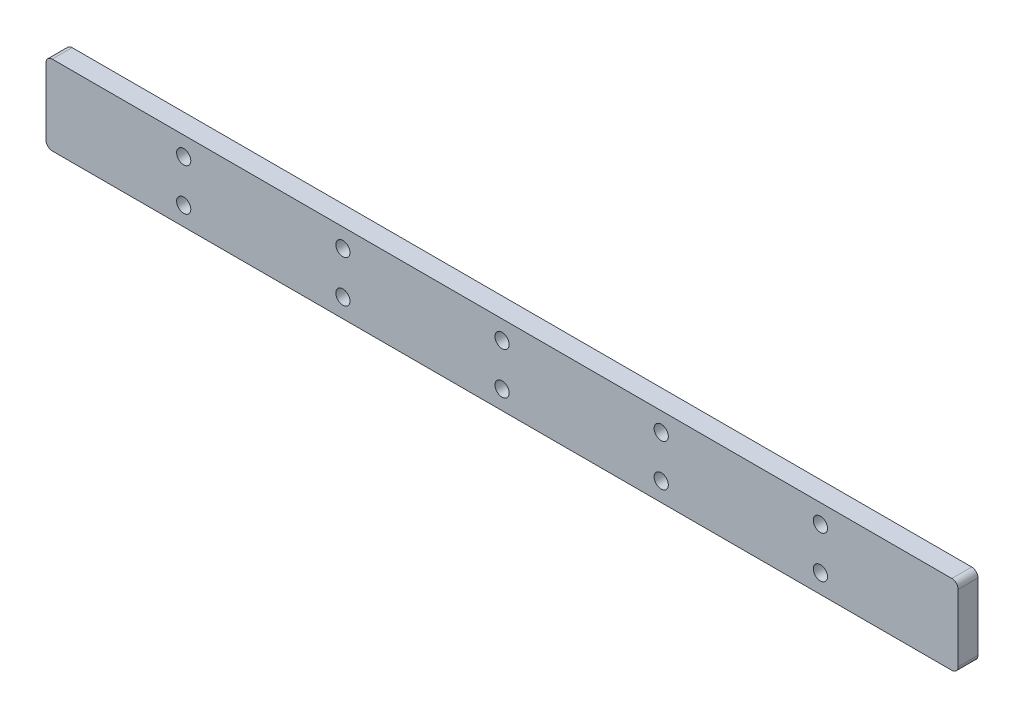
ISO-10303-21;
HEADER;
FILE_DESCRIPTION(('STEP AP214'),'2;1');
FILE_NAME('part.step','',(''),(''),'','','');
FILE_SCHEMA(('AUTOMOTIVE_DESIGN { 1 0 10303 214 1 1 1 1 }'));
ENDSEC;
DATA;
#1=APPLICATION_CONTEXT('core data for automotive mechanical design processes');
#2=APPLICATION_PROTOCOL_DEFINITION('international standard','automotive_design',2000,#1);
#3=PRODUCT_CONTEXT('',#1,'mechanical');
#4=PRODUCT('Part','Part','',(#3));
#5=PRODUCT_RELATED_PRODUCT_CATEGORY('part','',(#4));
#6=PRODUCT_DEFINITION_FORMATION('','',#4);
#7=PRODUCT_DEFINITION_CONTEXT('part definition',#1,'design');
#8=PRODUCT_DEFINITION('design','',#6,#7);
#9=PRODUCT_DEFINITION_SHAPE('','',#8);
#10=(LENGTH_UNIT() NAMED_UNIT(*) SI_UNIT(.MILLI.,.METRE.));
#11=(NAMED_UNIT(*) PLANE_ANGLE_UNIT() SI_UNIT($,.RADIAN.));
#12=(NAMED_UNIT(*) SI_UNIT($,.STERADIAN.) SOLID_ANGLE_UNIT());
#13=UNCERTAINTY_MEASURE_WITH_UNIT(LENGTH_MEASURE(1.E-05),#10,'distance_accuracy_value','');
#14=(GEOMETRIC_REPRESENTATION_CONTEXT(3) GLOBAL_UNCERTAINTY_ASSIGNED_CONTEXT((#13)) GLOBAL_UNIT_ASSIGNED_CONTEXT((#10,
#11,#12)) REPRESENTATION_CONTEXT('',''));
#15=CARTESIAN_POINT('',(0.,0.,0.));
#16=DIRECTION('',(0.,0.,1.));
#17=DIRECTION('',(1.,0.,0.));
#18=AXIS2_PLACEMENT_3D('',#15,#16,#17);
#19=CARTESIAN_POINT('',(-72.775,6.35,3.175));
#20=DIRECTION('',(1.,0.,0.));
#21=DIRECTION('',(0.,0.,-1.));
#22=AXIS2_PLACEMENT_3D('',#19,#20,#21);
#23=PLANE('',#22);
#24=DIRECTION('',(0.,-1.,0.));
#25=VECTOR('',#24,1.);
#26=CARTESIAN_POINT('',(-72.775,6.35,0.));
#27=LINE('',#26,#25);
#28=CARTESIAN_POINT('',(-72.775,5.35,0.));
#29=VERTEX_POINT('',#28);
#30=CARTESIAN_POINT('',(-72.775,-5.35,0.));
#31=VERTEX_POINT('',#30);
#32=EDGE_CURVE('E138',#29,#31,#27,.T.);
#33=ORIENTED_EDGE('',*,*,#32,.T.);
#34=DIRECTION('',(0.,0.,-1.));
#35=VECTOR('',#34,1.);
#36=CARTESIAN_POINT('',(-72.775,-5.35,3.175));
#37=LINE('',#36,#35);
#38=CARTESIAN_POINT('',(-72.775,-5.35,3.175));
#39=VERTEX_POINT('',#38);
#40=EDGE_CURVE('E11',#31,#39,#37,.F.);
#41=ORIENTED_EDGE('',*,*,#40,.T.);
#42=DIRECTION('',(0.,-1.,0.));
#43=VECTOR('',#42,1.);
#44=CARTESIAN_POINT('',(-72.775,6.35,3.175));
#45=LINE('',#44,#43);
#46=CARTESIAN_POINT('',(-72.775,5.35,3.175));
#47=VERTEX_POINT('',#46);
#48=EDGE_CURVE('E136',#47,#39,#45,.T.);
#49=ORIENTED_EDGE('',*,*,#48,.F.);
#50=DIRECTION('',(0.,0.,-1.));
#51=VECTOR('',#50,1.);
#52=CARTESIAN_POINT('',(-72.775,5.35,3.175));
#53=LINE('',#52,#51);
#54=EDGE_CURVE('E50',#47,#29,#53,.T.);
#55=ORIENTED_EDGE('',*,*,#54,.T.);
#56=EDGE_LOOP('',(#33,#41,#49,#55));
#57=FACE_BOUND('',#56,.T.);
#58=ADVANCED_FACE('F42',(#57),#23,.F.);
#59=CARTESIAN_POINT('',(-72.775,-6.35,3.175));
#60=DIRECTION('',(0.,1.,0.));
#61=DIRECTION('',(-1.,0.,0.));
#62=AXIS2_PLACEMENT_3D('',#59,#60,#61);
#63=PLANE('',#62);
#64=DIRECTION('',(1.,0.,0.));
#65=VECTOR('',#64,1.);
#66=CARTESIAN_POINT('',(-72.775,-6.35,0.));
#67=LINE('',#66,#65);
#68=CARTESIAN_POINT('',(-71.775,-6.35,0.));
#69=VERTEX_POINT('',#68);
#70=CARTESIAN_POINT('',(71.775,-6.35,0.));
#71=VERTEX_POINT('',#70);
#72=EDGE_CURVE('E134',#69,#71,#67,.T.);
#73=ORIENTED_EDGE('',*,*,#72,.T.);
#74=DIRECTION('',(0.,0.,-1.));
#75=VECTOR('',#74,1.);
#76=CARTESIAN_POINT('',(71.775,-6.35,3.175));
#77=LINE('',#76,#75);
#78=CARTESIAN_POINT('',(71.775,-6.35,3.175));
#79=VERTEX_POINT('',#78);
#80=EDGE_CURVE('E113',#71,#79,#77,.F.);
#81=ORIENTED_EDGE('',*,*,#80,.T.);
#82=DIRECTION('',(1.,0.,0.));
#83=VECTOR('',#82,1.);
#84=CARTESIAN_POINT('',(-72.775,-6.35,3.175));
#85=LINE('',#84,#83);
#86=CARTESIAN_POINT('',(-71.775,-6.35,3.175));
#87=VERTEX_POINT('',#86);
#88=EDGE_CURVE('E178',#87,#79,#85,.T.);
#89=ORIENTED_EDGE('',*,*,#88,.F.);
#90=DIRECTION('',(0.,0.,-1.));
#91=VECTOR('',#90,1.);
#92=CARTESIAN_POINT('',(-71.775,-6.35,3.175));
#93=LINE('',#92,#91);
#94=EDGE_CURVE('E118',#87,#69,#93,.T.);
#95=ORIENTED_EDGE('',*,*,#94,.T.);
#96=EDGE_LOOP('',(#73,#81,#89,#95));
#97=FACE_BOUND('',#96,.T.);
#98=ADVANCED_FACE('F267',(#97),#63,.F.);
#99=CARTESIAN_POINT('',(72.775,6.35,3.175));
#100=DIRECTION('',(-1.,0.,0.));
#101=DIRECTION('',(0.,0.,1.));
#102=AXIS2_PLACEMENT_3D('',#99,#100,#101);
#103=PLANE('',#102);
#104=DIRECTION('',(0.,1.,0.));
#105=VECTOR('',#104,1.);
#106=CARTESIAN_POINT('',(72.775,6.35,3.175));
#107=LINE('',#106,#105);
#108=CARTESIAN_POINT('',(72.775,-5.34999999999999,3.175));
#109=VERTEX_POINT('',#108);
#110=CARTESIAN_POINT('',(72.775,5.35,3.175));
#111=VERTEX_POINT('',#110);
#112=EDGE_CURVE('E127',#109,#111,#107,.T.);
#113=ORIENTED_EDGE('',*,*,#112,.F.);
#114=DIRECTION('',(0.,0.,-1.));
#115=VECTOR('',#114,1.);
#116=CARTESIAN_POINT('',(72.775,-5.34999999999999,3.175));
#117=LINE('',#116,#115);
#118=CARTESIAN_POINT('',(72.775,-5.34999999999999,0.));
#119=VERTEX_POINT('',#118);
#120=EDGE_CURVE('E112',#109,#119,#117,.T.);
#121=ORIENTED_EDGE('',*,*,#120,.T.);
#122=DIRECTION('',(0.,1.,0.));
#123=VECTOR('',#122,1.);
#124=CARTESIAN_POINT('',(72.775,6.35,0.));
#125=LINE('',#124,#123);
#126=CARTESIAN_POINT('',(72.775,5.35,0.));
#127=VERTEX_POINT('',#126);
#128=EDGE_CURVE('E125',#119,#127,#125,.T.);
#129=ORIENTED_EDGE('',*,*,#128,.T.);
#130=DIRECTION('',(0.,0.,-1.));
#131=VECTOR('',#130,1.);
#132=CARTESIAN_POINT('',(72.775,5.35,3.175));
#133=LINE('',#132,#131);
#134=EDGE_CURVE('E129',#127,#111,#133,.F.);
#135=ORIENTED_EDGE('',*,*,#134,.T.);
#136=EDGE_LOOP('',(#113,#121,#129,#135));
#137=FACE_BOUND('',#136,.T.);
#138=ADVANCED_FACE('F124',(#137),#103,.F.);
#139=CARTESIAN_POINT('',(-72.775,6.35,3.175));
#140=DIRECTION('',(0.,-1.,0.));
#141=DIRECTION('',(0.,0.,-1.));
#142=AXIS2_PLACEMENT_3D('',#139,#140,#141);
#143=PLANE('',#142);
#144=DIRECTION('',(-1.,0.,0.));
#145=VECTOR('',#144,1.);
#146=CARTESIAN_POINT('',(-72.775,6.35,3.175));
#147=LINE('',#146,#145);
#148=CARTESIAN_POINT('',(71.775,6.35,3.175));
#149=VERTEX_POINT('',#148);
#150=CARTESIAN_POINT('',(-71.775,6.35,3.175));
#151=VERTEX_POINT('',#150);
#152=EDGE_CURVE('E142',#149,#151,#147,.T.);
#153=ORIENTED_EDGE('',*,*,#152,.F.);
#154=DIRECTION('',(0.,0.,-1.));
#155=VECTOR('',#154,1.);
#156=CARTESIAN_POINT('',(71.775,6.35,3.175));
#157=LINE('',#156,#155);
#158=CARTESIAN_POINT('',(71.775,6.35,0.));
#159=VERTEX_POINT('',#158);
#160=EDGE_CURVE('E159',#149,#159,#157,.T.);
#161=ORIENTED_EDGE('',*,*,#160,.T.);
#162=DIRECTION('',(-1.,0.,0.));
#163=VECTOR('',#162,1.);
#164=CARTESIAN_POINT('',(-72.775,6.35,0.));
#165=LINE('',#164,#163);
#166=CARTESIAN_POINT('',(-71.775,6.35,0.));
#167=VERTEX_POINT('',#166);
#168=EDGE_CURVE('E133',#159,#167,#165,.T.);
#169=ORIENTED_EDGE('',*,*,#168,.T.);
#170=DIRECTION('',(0.,0.,-1.));
#171=VECTOR('',#170,1.);
#172=CARTESIAN_POINT('',(-71.775,6.35,3.175));
#173=LINE('',#172,#171);
#174=EDGE_CURVE('E57',#167,#151,#173,.F.);
#175=ORIENTED_EDGE('',*,*,#174,.T.);
#176=EDGE_LOOP('',(#153,#161,#169,#175));
#177=FACE_BOUND('',#176,.T.);
#178=ADVANCED_FACE('F244',(#177),#143,.F.);
#179=CARTESIAN_POINT('',(0.,0.,3.175));
#180=DIRECTION('',(0.,0.,1.));
#181=DIRECTION('',(1.,0.,0.));
#182=AXIS2_PLACEMENT_3D('',#179,#180,#181);
#183=PLANE('',#182);
#184=CARTESIAN_POINT('',(50.8,3.35,3.175));
#185=DIRECTION('',(0.,0.,1.));
#186=DIRECTION('',(1.,0.,0.));
#187=AXIS2_PLACEMENT_3D('',#184,#185,#186);
#188=CIRCLE('',#187,1.13029999999999);
#189=CARTESIAN_POINT('',(51.9303,3.35,3.175));
#190=VERTEX_POINT('',#189);
#191=EDGE_CURVE('E235',#190,#190,#188,.T.);
#192=ORIENTED_EDGE('',*,*,#191,.F.);
#193=EDGE_LOOP('',(#192));
#194=FACE_BOUND('',#193,.T.);
#195=CARTESIAN_POINT('',(50.8,-3.35,3.175));
#196=DIRECTION('',(0.,0.,1.));
#197=DIRECTION('',(1.,0.,0.));
#198=AXIS2_PLACEMENT_3D('',#195,#196,#197);
#199=CIRCLE('',#198,1.13029999999999);
#200=CARTESIAN_POINT('',(51.9303,-3.35,3.175));
#201=VERTEX_POINT('',#200);
#202=EDGE_CURVE('E229',#201,#201,#199,.T.);
#203=ORIENTED_EDGE('',*,*,#202,.F.);
#204=EDGE_LOOP('',(#203));
#205=FACE_BOUND('',#204,.T.);
#206=CARTESIAN_POINT('',(25.4,3.35,3.175));
#207=DIRECTION('',(0.,0.,1.));
#208=DIRECTION('',(1.,0.,0.));
#209=AXIS2_PLACEMENT_3D('',#206,#207,#208);
#210=CIRCLE('',#209,1.13029999999999);
#211=CARTESIAN_POINT('',(26.5303,3.35,3.175));
#212=VERTEX_POINT('',#211);
#213=EDGE_CURVE('E223',#212,#212,#210,.T.);
#214=ORIENTED_EDGE('',*,*,#213,.F.);
#215=EDGE_LOOP('',(#214));
#216=FACE_BOUND('',#215,.T.);
#217=CARTESIAN_POINT('',(25.4,-3.35,3.175));
#218=DIRECTION('',(0.,0.,1.));
#219=DIRECTION('',(1.,0.,0.));
#220=AXIS2_PLACEMENT_3D('',#217,#218,#219);
#221=CIRCLE('',#220,1.13029999999999);
#222=CARTESIAN_POINT('',(26.5303,-3.35,3.175));
#223=VERTEX_POINT('',#222);
#224=EDGE_CURVE('E217',#223,#223,#221,.T.);
#225=ORIENTED_EDGE('',*,*,#224,.F.);
#226=EDGE_LOOP('',(#225));
#227=FACE_BOUND('',#226,.T.);
#228=CARTESIAN_POINT('',(0.,3.35,3.175));
#229=DIRECTION('',(0.,0.,1.));
#230=DIRECTION('',(1.,0.,0.));
#231=AXIS2_PLACEMENT_3D('',#228,#229,#230);
#232=CIRCLE('',#231,1.13029999999999);
#233=CARTESIAN_POINT('',(1.13029999999998,3.35,3.175));
#234=VERTEX_POINT('',#233);
#235=EDGE_CURVE('E211',#234,#234,#232,.T.);
#236=ORIENTED_EDGE('',*,*,#235,.F.);
#237=EDGE_LOOP('',(#236));
#238=FACE_BOUND('',#237,.T.);
#239=CARTESIAN_POINT('',(0.,-3.35,3.175));
#240=DIRECTION('',(0.,0.,1.));
#241=DIRECTION('',(1.,0.,0.));
#242=AXIS2_PLACEMENT_3D('',#239,#240,#241);
#243=CIRCLE('',#242,1.13029999999999);
#244=CARTESIAN_POINT('',(1.13029999999998,-3.35,3.175));
#245=VERTEX_POINT('',#244);
#246=EDGE_CURVE('E205',#245,#245,#243,.T.);
#247=ORIENTED_EDGE('',*,*,#246,.F.);
#248=EDGE_LOOP('',(#247));
#249=FACE_BOUND('',#248,.T.);
#250=CARTESIAN_POINT('',(-25.4,3.35,3.175));
#251=DIRECTION('',(0.,0.,1.));
#252=DIRECTION('',(1.,0.,0.));
#253=AXIS2_PLACEMENT_3D('',#250,#251,#252);
#254=CIRCLE('',#253,1.13029999999999);
#255=CARTESIAN_POINT('',(-24.2697,3.35,3.175));
#256=VERTEX_POINT('',#255);
#257=EDGE_CURVE('E199',#256,#256,#254,.T.);
#258=ORIENTED_EDGE('',*,*,#257,.F.);
#259=EDGE_LOOP('',(#258));
#260=FACE_BOUND('',#259,.T.);
#261=CARTESIAN_POINT('',(-25.4,-3.35,3.175));
#262=DIRECTION('',(0.,0.,1.));
#263=DIRECTION('',(1.,0.,0.));
#264=AXIS2_PLACEMENT_3D('',#261,#262,#263);
#265=CIRCLE('',#264,1.13029999999999);
#266=CARTESIAN_POINT('',(-24.2697,-3.35,3.175));
#267=VERTEX_POINT('',#266);
#268=EDGE_CURVE('E193',#267,#267,#265,.T.);
#269=ORIENTED_EDGE('',*,*,#268,.F.);
#270=EDGE_LOOP('',(#269));
#271=FACE_BOUND('',#270,.T.);
#272=CARTESIAN_POINT('',(-50.8,3.35,3.175));
#273=DIRECTION('',(0.,0.,1.));
#274=DIRECTION('',(1.,0.,0.));
#275=AXIS2_PLACEMENT_3D('',#272,#273,#274);
#276=CIRCLE('',#275,1.13029999999999);
#277=CARTESIAN_POINT('',(-49.6697,3.35,3.175));
#278=VERTEX_POINT('',#277);
#279=EDGE_CURVE('E187',#278,#278,#276,.T.);
#280=ORIENTED_EDGE('',*,*,#279,.F.);
#281=EDGE_LOOP('',(#280));
#282=FACE_BOUND('',#281,.T.);
#283=CARTESIAN_POINT('',(-50.8,-3.35,3.175));
#284=DIRECTION('',(0.,0.,1.));
#285=DIRECTION('',(1.,0.,0.));
#286=AXIS2_PLACEMENT_3D('',#283,#284,#285);
#287=CIRCLE('',#286,1.13029999999999);
#288=CARTESIAN_POINT('',(-49.6697,-3.35,3.175));
#289=VERTEX_POINT('',#288);
#290=EDGE_CURVE('E173',#289,#289,#287,.T.);
#291=ORIENTED_EDGE('',*,*,#290,.F.);
#292=EDGE_LOOP('',(#291));
#293=FACE_BOUND('',#292,.T.);
#294=ORIENTED_EDGE('',*,*,#88,.T.);
#295=CARTESIAN_POINT('',(71.775,-5.34999999999999,3.175));
#296=DIRECTION('',(0.,0.,1.));
#297=DIRECTION('',(1.,0.,0.));
#298=AXIS2_PLACEMENT_3D('',#295,#296,#297);
#299=CIRCLE('',#298,1.);
#300=EDGE_CURVE('E156',#79,#109,#299,.T.);
#301=ORIENTED_EDGE('',*,*,#300,.T.);
#302=ORIENTED_EDGE('',*,*,#112,.T.);
#303=CARTESIAN_POINT('',(71.775,5.35,3.175));
#304=DIRECTION('',(0.,0.,1.));
#305=DIRECTION('',(1.,0.,0.));
#306=AXIS2_PLACEMENT_3D('',#303,#304,#305);
#307=CIRCLE('',#306,1.);
#308=EDGE_CURVE('E64',#111,#149,#307,.T.);
#309=ORIENTED_EDGE('',*,*,#308,.T.);
#310=ORIENTED_EDGE('',*,*,#152,.T.);
#311=CARTESIAN_POINT('',(-71.775,5.35,3.175));
#312=DIRECTION('',(0.,0.,1.));
#313=DIRECTION('',(1.,0.,0.));
#314=AXIS2_PLACEMENT_3D('',#311,#312,#313);
#315=CIRCLE('',#314,1.);
#316=EDGE_CURVE('E151',#151,#47,#315,.T.);
#317=ORIENTED_EDGE('',*,*,#316,.T.);
#318=ORIENTED_EDGE('',*,*,#48,.T.);
#319=CARTESIAN_POINT('',(-71.775,-5.35,3.175));
#320=DIRECTION('',(0.,0.,1.));
#321=DIRECTION('',(1.,0.,0.));
#322=AXIS2_PLACEMENT_3D('',#319,#320,#321);
#323=CIRCLE('',#322,1.);
#324=EDGE_CURVE('E153',#39,#87,#323,.T.);
#325=ORIENTED_EDGE('',*,*,#324,.T.);
#326=EDGE_LOOP('',(#294,#301,#302,#309,#310,#317,#318,#325));
#327=FACE_BOUND('',#326,.T.);
#328=ADVANCED_FACE('F241',(#194,#205,#216,#227,#238,#249,#260,#271,#282,#293,#327),#183,.T.);
#329=CARTESIAN_POINT('',(0.,0.,0.));
#330=DIRECTION('',(0.,0.,1.));
#331=DIRECTION('',(1.,0.,0.));
#332=AXIS2_PLACEMENT_3D('',#329,#330,#331);
#333=PLANE('',#332);
#334=CARTESIAN_POINT('',(50.8,3.35,0.));
#335=DIRECTION('',(0.,0.,1.));
#336=DIRECTION('',(1.,0.,0.));
#337=AXIS2_PLACEMENT_3D('',#334,#335,#336);
#338=CIRCLE('',#337,1.1303);
#339=CARTESIAN_POINT('',(51.9303,3.35,0.));
#340=VERTEX_POINT('',#339);
#341=EDGE_CURVE('E232',#340,#340,#338,.T.);
#342=ORIENTED_EDGE('',*,*,#341,.T.);
#343=EDGE_LOOP('',(#342));
#344=FACE_BOUND('',#343,.T.);
#345=CARTESIAN_POINT('',(50.8,-3.35,0.));
#346=DIRECTION('',(0.,0.,1.));
#347=DIRECTION('',(1.,0.,0.));
#348=AXIS2_PLACEMENT_3D('',#345,#346,#347);
#349=CIRCLE('',#348,1.1303);
#350=CARTESIAN_POINT('',(51.9303,-3.35,0.));
#351=VERTEX_POINT('',#350);
#352=EDGE_CURVE('E226',#351,#351,#349,.T.);
#353=ORIENTED_EDGE('',*,*,#352,.T.);
#354=EDGE_LOOP('',(#353));
#355=FACE_BOUND('',#354,.T.);
#356=CARTESIAN_POINT('',(25.4,3.35,0.));
#357=DIRECTION('',(0.,0.,1.));
#358=DIRECTION('',(1.,0.,0.));
#359=AXIS2_PLACEMENT_3D('',#356,#357,#358);
#360=CIRCLE('',#359,1.1303);
#361=CARTESIAN_POINT('',(26.5303,3.35,0.));
#362=VERTEX_POINT('',#361);
#363=EDGE_CURVE('E220',#362,#362,#360,.T.);
#364=ORIENTED_EDGE('',*,*,#363,.T.);
#365=EDGE_LOOP('',(#364));
#366=FACE_BOUND('',#365,.T.);
#367=CARTESIAN_POINT('',(25.4,-3.35,0.));
#368=DIRECTION('',(0.,0.,1.));
#369=DIRECTION('',(1.,0.,0.));
#370=AXIS2_PLACEMENT_3D('',#367,#368,#369);
#371=CIRCLE('',#370,1.1303);
#372=CARTESIAN_POINT('',(26.5303,-3.35,0.));
#373=VERTEX_POINT('',#372);
#374=EDGE_CURVE('E214',#373,#373,#371,.T.);
#375=ORIENTED_EDGE('',*,*,#374,.T.);
#376=EDGE_LOOP('',(#375));
#377=FACE_BOUND('',#376,.T.);
#378=CARTESIAN_POINT('',(0.,3.35,0.));
#379=DIRECTION('',(0.,0.,1.));
#380=DIRECTION('',(1.,0.,0.));
#381=AXIS2_PLACEMENT_3D('',#378,#379,#380);
#382=CIRCLE('',#381,1.1303);
#383=CARTESIAN_POINT('',(1.13029999999999,3.35,0.));
#384=VERTEX_POINT('',#383);
#385=EDGE_CURVE('E208',#384,#384,#382,.T.);
#386=ORIENTED_EDGE('',*,*,#385,.T.);
#387=EDGE_LOOP('',(#386));
#388=FACE_BOUND('',#387,.T.);
#389=CARTESIAN_POINT('',(0.,-3.35,0.));
#390=DIRECTION('',(0.,0.,1.));
#391=DIRECTION('',(1.,0.,0.));
#392=AXIS2_PLACEMENT_3D('',#389,#390,#391);
#393=CIRCLE('',#392,1.1303);
#394=CARTESIAN_POINT('',(1.13029999999999,-3.35,0.));
#395=VERTEX_POINT('',#394);
#396=EDGE_CURVE('E202',#395,#395,#393,.T.);
#397=ORIENTED_EDGE('',*,*,#396,.T.);
#398=EDGE_LOOP('',(#397));
#399=FACE_BOUND('',#398,.T.);
#400=CARTESIAN_POINT('',(-25.4,3.35,0.));
#401=DIRECTION('',(0.,0.,1.));
#402=DIRECTION('',(1.,0.,0.));
#403=AXIS2_PLACEMENT_3D('',#400,#401,#402);
#404=CIRCLE('',#403,1.1303);
#405=CARTESIAN_POINT('',(-24.2697,3.35,0.));
#406=VERTEX_POINT('',#405);
#407=EDGE_CURVE('E196',#406,#406,#404,.T.);
#408=ORIENTED_EDGE('',*,*,#407,.T.);
#409=EDGE_LOOP('',(#408));
#410=FACE_BOUND('',#409,.T.);
#411=CARTESIAN_POINT('',(-25.4,-3.35,0.));
#412=DIRECTION('',(0.,0.,1.));
#413=DIRECTION('',(1.,0.,0.));
#414=AXIS2_PLACEMENT_3D('',#411,#412,#413);
#415=CIRCLE('',#414,1.1303);
#416=CARTESIAN_POINT('',(-24.2697,-3.35,0.));
#417=VERTEX_POINT('',#416);
#418=EDGE_CURVE('E190',#417,#417,#415,.T.);
#419=ORIENTED_EDGE('',*,*,#418,.T.);
#420=EDGE_LOOP('',(#419));
#421=FACE_BOUND('',#420,.T.);
#422=CARTESIAN_POINT('',(-50.8,3.35,0.));
#423=DIRECTION('',(0.,0.,1.));
#424=DIRECTION('',(1.,0.,0.));
#425=AXIS2_PLACEMENT_3D('',#422,#423,#424);
#426=CIRCLE('',#425,1.1303);
#427=CARTESIAN_POINT('',(-49.6697,3.35,0.));
#428=VERTEX_POINT('',#427);
#429=EDGE_CURVE('E184',#428,#428,#426,.T.);
#430=ORIENTED_EDGE('',*,*,#429,.T.);
#431=EDGE_LOOP('',(#430));
#432=FACE_BOUND('',#431,.T.);
#433=CARTESIAN_POINT('',(-50.8,-3.35,0.));
#434=DIRECTION('',(0.,0.,1.));
#435=DIRECTION('',(1.,0.,0.));
#436=AXIS2_PLACEMENT_3D('',#433,#434,#435);
#437=CIRCLE('',#436,1.1303);
#438=CARTESIAN_POINT('',(-49.6697,-3.35,0.));
#439=VERTEX_POINT('',#438);
#440=EDGE_CURVE('E171',#439,#439,#437,.T.);
#441=ORIENTED_EDGE('',*,*,#440,.T.);
#442=EDGE_LOOP('',(#441));
#443=FACE_BOUND('',#442,.T.);
#444=ORIENTED_EDGE('',*,*,#128,.F.);
#445=CARTESIAN_POINT('',(71.775,-5.34999999999999,0.));
#446=DIRECTION('',(0.,0.,1.));
#447=DIRECTION('',(1.,0.,0.));
#448=AXIS2_PLACEMENT_3D('',#445,#446,#447);
#449=CIRCLE('',#448,1.);
#450=EDGE_CURVE('E108',#119,#71,#449,.F.);
#451=ORIENTED_EDGE('',*,*,#450,.T.);
#452=ORIENTED_EDGE('',*,*,#72,.F.);
#453=CARTESIAN_POINT('',(-71.775,-5.35,0.));
#454=DIRECTION('',(0.,0.,1.));
#455=DIRECTION('',(1.,0.,0.));
#456=AXIS2_PLACEMENT_3D('',#453,#454,#455);
#457=CIRCLE('',#456,1.);
#458=EDGE_CURVE('E145',#69,#31,#457,.F.);
#459=ORIENTED_EDGE('',*,*,#458,.T.);
#460=ORIENTED_EDGE('',*,*,#32,.F.);
#461=CARTESIAN_POINT('',(-71.775,5.35,0.));
#462=DIRECTION('',(0.,0.,1.));
#463=DIRECTION('',(1.,0.,0.));
#464=AXIS2_PLACEMENT_3D('',#461,#462,#463);
#465=CIRCLE('',#464,1.);
#466=EDGE_CURVE('E128',#29,#167,#465,.F.);
#467=ORIENTED_EDGE('',*,*,#466,.T.);
#468=ORIENTED_EDGE('',*,*,#168,.F.);
#469=CARTESIAN_POINT('',(71.775,5.35,0.));
#470=DIRECTION('',(0.,0.,1.));
#471=DIRECTION('',(1.,0.,0.));
#472=AXIS2_PLACEMENT_3D('',#469,#470,#471);
#473=CIRCLE('',#472,1.);
#474=EDGE_CURVE('E119',#159,#127,#473,.F.);
#475=ORIENTED_EDGE('',*,*,#474,.T.);
#476=EDGE_LOOP('',(#444,#451,#452,#459,#460,#467,#468,#475));
#477=FACE_BOUND('',#476,.T.);
#478=ADVANCED_FACE('F131',(#344,#355,#366,#377,#388,#399,#410,#421,#432,#443,#477),#333,.F.);
#479=CARTESIAN_POINT('',(-50.8,-3.35,3.175));
#480=DIRECTION('',(0.,0.,1.));
#481=DIRECTION('',(1.,0.,0.));
#482=AXIS2_PLACEMENT_3D('',#479,#480,#481);
#483=CYLINDRICAL_SURFACE('',#482,1.13029999999999);
#484=ORIENTED_EDGE('',*,*,#440,.F.);
#485=EDGE_LOOP('',(#484));
#486=FACE_BOUND('',#485,.T.);
#487=ORIENTED_EDGE('',*,*,#290,.T.);
#488=EDGE_LOOP('',(#487));
#489=FACE_BOUND('',#488,.T.);
#490=ADVANCED_FACE('F297',(#486,#489),#483,.F.);
#491=CARTESIAN_POINT('',(-50.8,3.35,3.175));
#492=DIRECTION('',(0.,0.,1.));
#493=DIRECTION('',(1.,0.,0.));
#494=AXIS2_PLACEMENT_3D('',#491,#492,#493);
#495=CYLINDRICAL_SURFACE('',#494,1.13029999999999);
#496=ORIENTED_EDGE('',*,*,#429,.F.);
#497=EDGE_LOOP('',(#496));
#498=FACE_BOUND('',#497,.T.);
#499=ORIENTED_EDGE('',*,*,#279,.T.);
#500=EDGE_LOOP('',(#499));
#501=FACE_BOUND('',#500,.T.);
#502=ADVANCED_FACE('F302',(#498,#501),#495,.F.);
#503=CARTESIAN_POINT('',(-25.4,-3.35,3.175));
#504=DIRECTION('',(0.,0.,1.));
#505=DIRECTION('',(1.,0.,0.));
#506=AXIS2_PLACEMENT_3D('',#503,#504,#505);
#507=CYLINDRICAL_SURFACE('',#506,1.13029999999999);
#508=ORIENTED_EDGE('',*,*,#418,.F.);
#509=EDGE_LOOP('',(#508));
#510=FACE_BOUND('',#509,.T.);
#511=ORIENTED_EDGE('',*,*,#268,.T.);
#512=EDGE_LOOP('',(#511));
#513=FACE_BOUND('',#512,.T.);
#514=ADVANCED_FACE('F306',(#510,#513),#507,.F.);
#515=CARTESIAN_POINT('',(-25.4,3.35,3.175));
#516=DIRECTION('',(0.,0.,1.));
#517=DIRECTION('',(1.,0.,0.));
#518=AXIS2_PLACEMENT_3D('',#515,#516,#517);
#519=CYLINDRICAL_SURFACE('',#518,1.13029999999999);
#520=ORIENTED_EDGE('',*,*,#407,.F.);
#521=EDGE_LOOP('',(#520));
#522=FACE_BOUND('',#521,.T.);
#523=ORIENTED_EDGE('',*,*,#257,.T.);
#524=EDGE_LOOP('',(#523));
#525=FACE_BOUND('',#524,.T.);
#526=ADVANCED_FACE('F310',(#522,#525),#519,.F.);
#527=CARTESIAN_POINT('',(0.,-3.35,3.175));
#528=DIRECTION('',(0.,0.,1.));
#529=DIRECTION('',(1.,0.,0.));
#530=AXIS2_PLACEMENT_3D('',#527,#528,#529);
#531=CYLINDRICAL_SURFACE('',#530,1.13029999999999);
#532=ORIENTED_EDGE('',*,*,#396,.F.);
#533=EDGE_LOOP('',(#532));
#534=FACE_BOUND('',#533,.T.);
#535=ORIENTED_EDGE('',*,*,#246,.T.);
#536=EDGE_LOOP('',(#535));
#537=FACE_BOUND('',#536,.T.);
#538=ADVANCED_FACE('F314',(#534,#537),#531,.F.);
#539=CARTESIAN_POINT('',(0.,3.35,3.175));
#540=DIRECTION('',(0.,0.,1.));
#541=DIRECTION('',(1.,0.,0.));
#542=AXIS2_PLACEMENT_3D('',#539,#540,#541);
#543=CYLINDRICAL_SURFACE('',#542,1.13029999999999);
#544=ORIENTED_EDGE('',*,*,#385,.F.);
#545=EDGE_LOOP('',(#544));
#546=FACE_BOUND('',#545,.T.);
#547=ORIENTED_EDGE('',*,*,#235,.T.);
#548=EDGE_LOOP('',(#547));
#549=FACE_BOUND('',#548,.T.);
#550=ADVANCED_FACE('F318',(#546,#549),#543,.F.);
#551=CARTESIAN_POINT('',(25.4,-3.35,3.175));
#552=DIRECTION('',(0.,0.,1.));
#553=DIRECTION('',(1.,0.,0.));
#554=AXIS2_PLACEMENT_3D('',#551,#552,#553);
#555=CYLINDRICAL_SURFACE('',#554,1.13029999999999);
#556=ORIENTED_EDGE('',*,*,#374,.F.);
#557=EDGE_LOOP('',(#556));
#558=FACE_BOUND('',#557,.T.);
#559=ORIENTED_EDGE('',*,*,#224,.T.);
#560=EDGE_LOOP('',(#559));
#561=FACE_BOUND('',#560,.T.);
#562=ADVANCED_FACE('F322',(#558,#561),#555,.F.);
#563=CARTESIAN_POINT('',(25.4,3.35,3.175));
#564=DIRECTION('',(0.,0.,1.));
#565=DIRECTION('',(1.,0.,0.));
#566=AXIS2_PLACEMENT_3D('',#563,#564,#565);
#567=CYLINDRICAL_SURFACE('',#566,1.13029999999999);
#568=ORIENTED_EDGE('',*,*,#363,.F.);
#569=EDGE_LOOP('',(#568));
#570=FACE_BOUND('',#569,.T.);
#571=ORIENTED_EDGE('',*,*,#213,.T.);
#572=EDGE_LOOP('',(#571));
#573=FACE_BOUND('',#572,.T.);
#574=ADVANCED_FACE('F326',(#570,#573),#567,.F.);
#575=CARTESIAN_POINT('',(50.8,-3.35,3.175));
#576=DIRECTION('',(0.,0.,1.));
#577=DIRECTION('',(1.,0.,0.));
#578=AXIS2_PLACEMENT_3D('',#575,#576,#577);
#579=CYLINDRICAL_SURFACE('',#578,1.13029999999999);
#580=ORIENTED_EDGE('',*,*,#352,.F.);
#581=EDGE_LOOP('',(#580));
#582=FACE_BOUND('',#581,.T.);
#583=ORIENTED_EDGE('',*,*,#202,.T.);
#584=EDGE_LOOP('',(#583));
#585=FACE_BOUND('',#584,.T.);
#586=ADVANCED_FACE('F330',(#582,#585),#579,.F.);
#587=CARTESIAN_POINT('',(50.8,3.35,3.175));
#588=DIRECTION('',(0.,0.,1.));
#589=DIRECTION('',(1.,0.,0.));
#590=AXIS2_PLACEMENT_3D('',#587,#588,#589);
#591=CYLINDRICAL_SURFACE('',#590,1.13029999999999);
#592=ORIENTED_EDGE('',*,*,#341,.F.);
#593=EDGE_LOOP('',(#592));
#594=FACE_BOUND('',#593,.T.);
#595=ORIENTED_EDGE('',*,*,#191,.T.);
#596=EDGE_LOOP('',(#595));
#597=FACE_BOUND('',#596,.T.);
#598=ADVANCED_FACE('F239',(#594,#597),#591,.F.);
#599=CARTESIAN_POINT('',(71.775,-5.34999999999999,3.175));
#600=DIRECTION('',(0.,0.,-1.));
#601=DIRECTION('',(-1.,0.,0.));
#602=AXIS2_PLACEMENT_3D('',#599,#600,#601);
#603=CYLINDRICAL_SURFACE('',#602,1.);
#604=ORIENTED_EDGE('',*,*,#300,.F.);
#605=ORIENTED_EDGE('',*,*,#80,.F.);
#606=ORIENTED_EDGE('',*,*,#450,.F.);
#607=ORIENTED_EDGE('',*,*,#120,.F.);
#608=EDGE_LOOP('',(#604,#605,#606,#607));
#609=FACE_BOUND('',#608,.T.);
#610=ADVANCED_FACE('F111',(#609),#603,.T.);
#611=CARTESIAN_POINT('',(71.775,5.35,3.175));
#612=DIRECTION('',(0.,0.,-1.));
#613=DIRECTION('',(-1.,0.,0.));
#614=AXIS2_PLACEMENT_3D('',#611,#612,#613);
#615=CYLINDRICAL_SURFACE('',#614,1.);
#616=ORIENTED_EDGE('',*,*,#308,.F.);
#617=ORIENTED_EDGE('',*,*,#134,.F.);
#618=ORIENTED_EDGE('',*,*,#474,.F.);
#619=ORIENTED_EDGE('',*,*,#160,.F.);
#620=EDGE_LOOP('',(#616,#617,#618,#619));
#621=FACE_BOUND('',#620,.T.);
#622=ADVANCED_FACE('F274',(#621),#615,.T.);
#623=CARTESIAN_POINT('',(-71.775,-5.35,3.175));
#624=DIRECTION('',(0.,0.,-1.));
#625=DIRECTION('',(-1.,0.,0.));
#626=AXIS2_PLACEMENT_3D('',#623,#624,#625);
#627=CYLINDRICAL_SURFACE('',#626,1.);
#628=ORIENTED_EDGE('',*,*,#324,.F.);
#629=ORIENTED_EDGE('',*,*,#40,.F.);
#630=ORIENTED_EDGE('',*,*,#458,.F.);
#631=ORIENTED_EDGE('',*,*,#94,.F.);
#632=EDGE_LOOP('',(#628,#629,#630,#631));
#633=FACE_BOUND('',#632,.T.);
#634=ADVANCED_FACE('F269',(#633),#627,.T.);
#635=CARTESIAN_POINT('',(-71.775,5.35,3.175));
#636=DIRECTION('',(0.,0.,-1.));
#637=DIRECTION('',(-1.,0.,0.));
#638=AXIS2_PLACEMENT_3D('',#635,#636,#637);
#639=CYLINDRICAL_SURFACE('',#638,1.);
#640=ORIENTED_EDGE('',*,*,#316,.F.);
#641=ORIENTED_EDGE('',*,*,#174,.F.);
#642=ORIENTED_EDGE('',*,*,#466,.F.);
#643=ORIENTED_EDGE('',*,*,#54,.F.);
#644=EDGE_LOOP('',(#640,#641,#642,#643));
#645=FACE_BOUND('',#644,.T.);
#646=ADVANCED_FACE('F44',(#645),#639,.T.);
#647=CLOSED_SHELL('',(#58,#98,#138,#178,#328,#478,#490,#502,#514,#526,#538,#550,#562,#574,#586,
#598,#610,#622,#634,#646));
#648=MANIFOLD_SOLID_BREP('B2',#647);
#649=ADVANCED_BREP_SHAPE_REPRESENTATION('',(#18,#648),#14);
#650=SHAPE_DEFINITION_REPRESENTATION(#9,#649);
ENDSEC;
END-ISO-10303-21;
